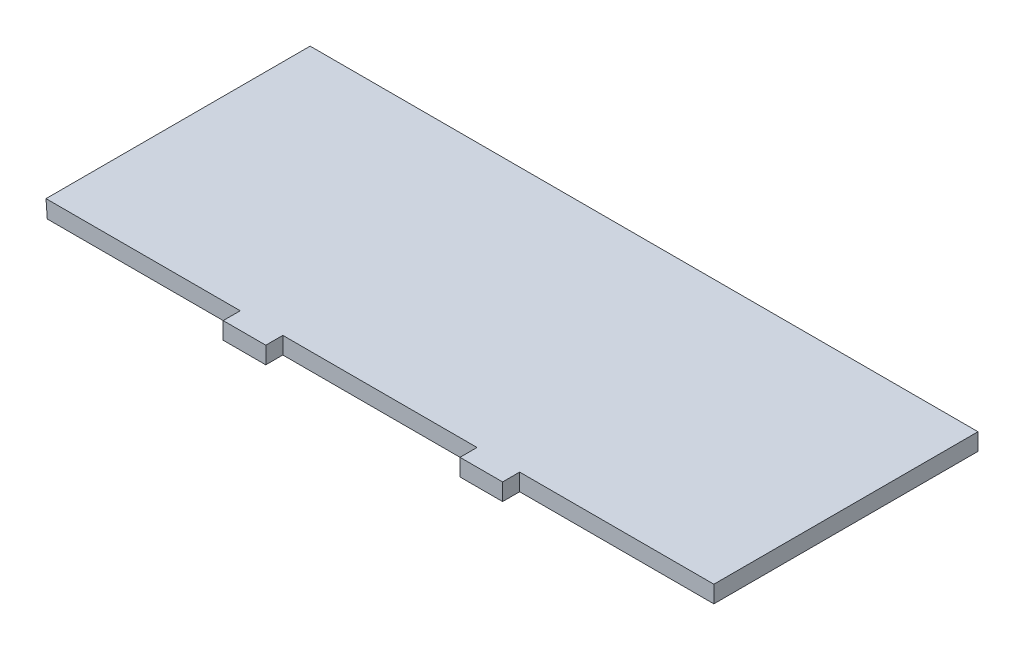
ISO-10303-21;
HEADER;
FILE_DESCRIPTION(('STEP AP214'),'2;1');
FILE_NAME('part.step','',(''),(''),'','','');
FILE_SCHEMA(('AUTOMOTIVE_DESIGN { 1 0 10303 214 1 1 1 1 }'));
ENDSEC;
DATA;
#1=APPLICATION_CONTEXT('core data for automotive mechanical design processes');
#2=APPLICATION_PROTOCOL_DEFINITION('international standard','automotive_design',2000,#1);
#3=PRODUCT_CONTEXT('',#1,'mechanical');
#4=PRODUCT('Part','Part','',(#3));
#5=PRODUCT_RELATED_PRODUCT_CATEGORY('part','',(#4));
#6=PRODUCT_DEFINITION_FORMATION('','',#4);
#7=PRODUCT_DEFINITION_CONTEXT('part definition',#1,'design');
#8=PRODUCT_DEFINITION('design','',#6,#7);
#9=PRODUCT_DEFINITION_SHAPE('','',#8);
#10=(LENGTH_UNIT() NAMED_UNIT(*) SI_UNIT(.MILLI.,.METRE.));
#11=(NAMED_UNIT(*) PLANE_ANGLE_UNIT() SI_UNIT($,.RADIAN.));
#12=(NAMED_UNIT(*) SI_UNIT($,.STERADIAN.) SOLID_ANGLE_UNIT());
#13=UNCERTAINTY_MEASURE_WITH_UNIT(LENGTH_MEASURE(1.E-05),#10,'distance_accuracy_value','');
#14=(GEOMETRIC_REPRESENTATION_CONTEXT(3) GLOBAL_UNCERTAINTY_ASSIGNED_CONTEXT((#13)) GLOBAL_UNIT_ASSIGNED_CONTEXT((#10,
#11,#12)) REPRESENTATION_CONTEXT('',''));
#15=CARTESIAN_POINT('',(0.,0.,0.));
#16=DIRECTION('',(0.,0.,1.));
#17=DIRECTION('',(1.,0.,0.));
#18=AXIS2_PLACEMENT_3D('',#15,#16,#17);
#19=CARTESIAN_POINT('',(380.,-80.,-940.));
#20=DIRECTION('',(0.,0.,-1.));
#21=DIRECTION('',(-1.,0.,0.));
#22=AXIS2_PLACEMENT_3D('',#19,#20,#21);
#23=PLANE('',#22);
#24=DIRECTION('',(1.,0.,0.));
#25=VECTOR('',#24,1.);
#26=CARTESIAN_POINT('',(377.763621659376,-48.,-940.));
#27=LINE('',#26,#25);
#28=CARTESIAN_POINT('',(405.409686513334,-48.,-940.));
#29=VERTEX_POINT('',#28);
#30=CARTESIAN_POINT('',(428.204843256667,-48.,-940.));
#31=VERTEX_POINT('',#30);
#32=EDGE_CURVE('E64',#29,#31,#27,.T.);
#33=ORIENTED_EDGE('',*,*,#32,.F.);
#34=DIRECTION('',(0.,1.,0.));
#35=VECTOR('',#34,1.);
#36=CARTESIAN_POINT('',(405.409686513334,-50.,-940.));
#37=LINE('',#36,#35);
#38=CARTESIAN_POINT('',(405.409686513334,-50.,-940.));
#39=VERTEX_POINT('',#38);
#40=EDGE_CURVE('E136',#39,#29,#37,.T.);
#41=ORIENTED_EDGE('',*,*,#40,.F.);
#42=DIRECTION('',(1.,0.,0.));
#43=VECTOR('',#42,1.);
#44=CARTESIAN_POINT('',(377.763621659376,-50.,-940.));
#45=LINE('',#44,#43);
#46=CARTESIAN_POINT('',(428.204843256667,-50.,-940.));
#47=VERTEX_POINT('',#46);
#48=EDGE_CURVE('E147',#39,#47,#45,.T.);
#49=ORIENTED_EDGE('',*,*,#48,.T.);
#50=DIRECTION('',(0.,1.,0.));
#51=VECTOR('',#50,1.);
#52=CARTESIAN_POINT('',(428.204843256667,-50.,-940.));
#53=LINE('',#52,#51);
#54=EDGE_CURVE('E180',#47,#31,#53,.T.);
#55=ORIENTED_EDGE('',*,*,#54,.T.);
#56=EDGE_LOOP('',(#33,#41,#49,#55));
#57=FACE_BOUND('',#56,.T.);
#58=ADVANCED_FACE('F42',(#57),#23,.F.);
#59=DIRECTION('',(0.,1.,0.));
#60=VECTOR('',#59,1.);
#61=CARTESIAN_POINT('',(433.204843256667,-50.,-940.));
#62=LINE('',#61,#60);
#63=CARTESIAN_POINT('',(433.204843256667,-50.,-940.));
#64=VERTEX_POINT('',#63);
#65=CARTESIAN_POINT('',(433.204843256667,-48.,-940.));
#66=VERTEX_POINT('',#65);
#67=EDGE_CURVE('E187',#64,#66,#62,.T.);
#68=ORIENTED_EDGE('',*,*,#67,.F.);
#69=CARTESIAN_POINT('',(456.,-50.,-940.));
#70=VERTEX_POINT('',#69);
#71=EDGE_CURVE('E159',#64,#70,#45,.T.);
#72=ORIENTED_EDGE('',*,*,#71,.T.);
#73=DIRECTION('',(0.,-1.,0.));
#74=VECTOR('',#73,1.);
#75=CARTESIAN_POINT('',(456.,150.,-940.));
#76=LINE('',#75,#74);
#77=CARTESIAN_POINT('',(456.,-48.,-940.));
#78=VERTEX_POINT('',#77);
#79=EDGE_CURVE('E195',#78,#70,#76,.T.);
#80=ORIENTED_EDGE('',*,*,#79,.F.);
#81=EDGE_CURVE('E194',#66,#78,#27,.T.);
#82=ORIENTED_EDGE('',*,*,#81,.F.);
#83=EDGE_LOOP('',(#68,#72,#80,#82));
#84=FACE_BOUND('',#83,.T.);
#85=ADVANCED_FACE('F248',(#84),#23,.F.);
#86=CARTESIAN_POINT('',(377.614529770002,-48.,-937.989999999988));
#87=DIRECTION('',(0.997232978197756,0.0743396744332018,0.));
#88=DIRECTION('',(-0.0743396744332018,0.997232978197756,0.));
#89=AXIS2_PLACEMENT_3D('',#86,#87,#88);
#90=PLANE('',#89);
#91=DIRECTION('',(0.,0.,1.));
#92=VECTOR('',#91,1.);
#93=CARTESIAN_POINT('',(377.614529770002,-48.,-971.));
#94=LINE('',#93,#92);
#95=CARTESIAN_POINT('',(377.614529770002,-48.,-971.));
#96=VERTEX_POINT('',#95);
#97=CARTESIAN_POINT('',(377.614529770002,-48.,-940.));
#98=VERTEX_POINT('',#97);
#99=EDGE_CURVE('E198',#96,#98,#94,.T.);
#100=ORIENTED_EDGE('',*,*,#99,.F.);
#101=DIRECTION('',(0.0743396744332018,-0.997232978197756,0.));
#102=VECTOR('',#101,1.);
#103=CARTESIAN_POINT('',(371.9692548713,27.7287994990571,-971.));
#104=LINE('',#103,#102);
#105=CARTESIAN_POINT('',(377.763621659376,-50.,-971.));
#106=VERTEX_POINT('',#105);
#107=EDGE_CURVE('E162',#96,#106,#104,.T.);
#108=ORIENTED_EDGE('',*,*,#107,.T.);
#109=DIRECTION('',(0.,0.,1.));
#110=VECTOR('',#109,1.);
#111=CARTESIAN_POINT('',(377.763621659376,-50.,-971.));
#112=LINE('',#111,#110);
#113=CARTESIAN_POINT('',(377.763621659376,-50.,-940.));
#114=VERTEX_POINT('',#113);
#115=EDGE_CURVE('E163',#106,#114,#112,.T.);
#116=ORIENTED_EDGE('',*,*,#115,.T.);
#117=DIRECTION('',(0.0743396744332018,-0.997232978197756,0.));
#118=VECTOR('',#117,1.);
#119=CARTESIAN_POINT('',(380.,-80.,-940.));
#120=LINE('',#119,#118);
#121=EDGE_CURVE('E46',#98,#114,#120,.T.);
#122=ORIENTED_EDGE('',*,*,#121,.F.);
#123=EDGE_LOOP('',(#100,#108,#116,#122));
#124=FACE_BOUND('',#123,.T.);
#125=ADVANCED_FACE('F218',(#124),#90,.F.);
#126=CARTESIAN_POINT('',(400.409686513334,-50.,-940.));
#127=VERTEX_POINT('',#126);
#128=EDGE_CURVE('E158',#114,#127,#45,.T.);
#129=ORIENTED_EDGE('',*,*,#128,.T.);
#130=DIRECTION('',(0.,1.,0.));
#131=VECTOR('',#130,1.);
#132=CARTESIAN_POINT('',(400.409686513334,-50.,-940.));
#133=LINE('',#132,#131);
#134=CARTESIAN_POINT('',(400.409686513334,-48.,-940.));
#135=VERTEX_POINT('',#134);
#136=EDGE_CURVE('E149',#127,#135,#133,.T.);
#137=ORIENTED_EDGE('',*,*,#136,.T.);
#138=EDGE_CURVE('E190',#98,#135,#27,.T.);
#139=ORIENTED_EDGE('',*,*,#138,.F.);
#140=ORIENTED_EDGE('',*,*,#121,.T.);
#141=EDGE_LOOP('',(#129,#137,#139,#140));
#142=FACE_BOUND('',#141,.T.);
#143=ADVANCED_FACE('F223',(#142),#23,.F.);
#144=CARTESIAN_POINT('',(377.763621659376,-50.,-971.));
#145=DIRECTION('',(0.,-1.,0.));
#146=DIRECTION('',(0.,0.,-1.));
#147=AXIS2_PLACEMENT_3D('',#144,#145,#146);
#148=PLANE('',#147);
#149=DIRECTION('',(0.,0.,-1.));
#150=VECTOR('',#149,1.);
#151=CARTESIAN_POINT('',(456.,-50.,-971.));
#152=LINE('',#151,#150);
#153=CARTESIAN_POINT('',(456.,-50.,-971.));
#154=VERTEX_POINT('',#153);
#155=EDGE_CURVE('E204',#70,#154,#152,.T.);
#156=ORIENTED_EDGE('',*,*,#155,.F.);
#157=ORIENTED_EDGE('',*,*,#71,.F.);
#158=DIRECTION('',(0.,0.,-1.));
#159=VECTOR('',#158,1.);
#160=CARTESIAN_POINT('',(433.204843256667,-50.,-940.));
#161=LINE('',#160,#159);
#162=CARTESIAN_POINT('',(433.204843256667,-50.,-938.));
#163=VERTEX_POINT('',#162);
#164=EDGE_CURVE('E232',#163,#64,#161,.T.);
#165=ORIENTED_EDGE('',*,*,#164,.F.);
#166=DIRECTION('',(1.,0.,0.));
#167=VECTOR('',#166,1.);
#168=CARTESIAN_POINT('',(433.204843256667,-50.,-938.));
#169=LINE('',#168,#167);
#170=CARTESIAN_POINT('',(428.204843256667,-50.,-938.));
#171=VERTEX_POINT('',#170);
#172=EDGE_CURVE('E189',#171,#163,#169,.T.);
#173=ORIENTED_EDGE('',*,*,#172,.F.);
#174=DIRECTION('',(0.,0.,1.));
#175=VECTOR('',#174,1.);
#176=CARTESIAN_POINT('',(428.204843256667,-50.,-940.));
#177=LINE('',#176,#175);
#178=EDGE_CURVE('E157',#47,#171,#177,.T.);
#179=ORIENTED_EDGE('',*,*,#178,.F.);
#180=ORIENTED_EDGE('',*,*,#48,.F.);
#181=DIRECTION('',(0.,0.,-1.));
#182=VECTOR('',#181,1.);
#183=CARTESIAN_POINT('',(405.409686513334,-50.,-940.));
#184=LINE('',#183,#182);
#185=CARTESIAN_POINT('',(405.409686513334,-50.,-938.));
#186=VERTEX_POINT('',#185);
#187=EDGE_CURVE('E133',#186,#39,#184,.T.);
#188=ORIENTED_EDGE('',*,*,#187,.F.);
#189=DIRECTION('',(1.,0.,0.));
#190=VECTOR('',#189,1.);
#191=CARTESIAN_POINT('',(405.409686513334,-50.,-938.));
#192=LINE('',#191,#190);
#193=CARTESIAN_POINT('',(400.409686513334,-50.,-938.));
#194=VERTEX_POINT('',#193);
#195=EDGE_CURVE('E150',#194,#186,#192,.T.);
#196=ORIENTED_EDGE('',*,*,#195,.F.);
#197=DIRECTION('',(0.,0.,1.));
#198=VECTOR('',#197,1.);
#199=CARTESIAN_POINT('',(400.409686513334,-50.,-940.));
#200=LINE('',#199,#198);
#201=EDGE_CURVE('E142',#127,#194,#200,.T.);
#202=ORIENTED_EDGE('',*,*,#201,.F.);
#203=ORIENTED_EDGE('',*,*,#128,.F.);
#204=ORIENTED_EDGE('',*,*,#115,.F.);
#205=DIRECTION('',(1.,0.,0.));
#206=VECTOR('',#205,1.);
#207=CARTESIAN_POINT('',(377.763621659376,-50.,-971.));
#208=LINE('',#207,#206);
#209=EDGE_CURVE('E51',#106,#154,#208,.T.);
#210=ORIENTED_EDGE('',*,*,#209,.T.);
#211=EDGE_LOOP('',(#156,#157,#165,#173,#179,#180,#188,#196,#202,#203,#204,#210));
#212=FACE_BOUND('',#211,.T.);
#213=ADVANCED_FACE('F154',(#212),#148,.T.);
#214=CARTESIAN_POINT('',(0.,0.,-971.));
#215=DIRECTION('',(0.,0.,-1.));
#216=DIRECTION('',(-1.,0.,0.));
#217=AXIS2_PLACEMENT_3D('',#214,#215,#216);
#218=PLANE('',#217);
#219=ORIENTED_EDGE('',*,*,#107,.F.);
#220=DIRECTION('',(1.,0.,0.));
#221=VECTOR('',#220,1.);
#222=CARTESIAN_POINT('',(377.763621659376,-48.,-971.));
#223=LINE('',#222,#221);
#224=CARTESIAN_POINT('',(456.,-48.,-971.));
#225=VERTEX_POINT('',#224);
#226=EDGE_CURVE('E11',#96,#225,#223,.T.);
#227=ORIENTED_EDGE('',*,*,#226,.T.);
#228=DIRECTION('',(0.,1.,0.));
#229=VECTOR('',#228,1.);
#230=CARTESIAN_POINT('',(456.,0.,-971.));
#231=LINE('',#230,#229);
#232=EDGE_CURVE('E200',#154,#225,#231,.T.);
#233=ORIENTED_EDGE('',*,*,#232,.F.);
#234=ORIENTED_EDGE('',*,*,#209,.F.);
#235=EDGE_LOOP('',(#219,#227,#233,#234));
#236=FACE_BOUND('',#235,.T.);
#237=ADVANCED_FACE('F44',(#236),#218,.T.);
#238=CARTESIAN_POINT('',(456.,150.,-938.));
#239=DIRECTION('',(-1.,0.,0.));
#240=DIRECTION('',(0.,0.,1.));
#241=AXIS2_PLACEMENT_3D('',#238,#239,#240);
#242=PLANE('',#241);
#243=DIRECTION('',(0.,0.,1.));
#244=VECTOR('',#243,1.);
#245=CARTESIAN_POINT('',(456.,-48.,-971.));
#246=LINE('',#245,#244);
#247=EDGE_CURVE('E193',#225,#78,#246,.T.);
#248=ORIENTED_EDGE('',*,*,#247,.T.);
#249=ORIENTED_EDGE('',*,*,#79,.T.);
#250=ORIENTED_EDGE('',*,*,#155,.T.);
#251=ORIENTED_EDGE('',*,*,#232,.T.);
#252=EDGE_LOOP('',(#248,#249,#250,#251));
#253=FACE_BOUND('',#252,.T.);
#254=ADVANCED_FACE('F209',(#253),#242,.F.);
#255=CARTESIAN_POINT('',(377.763621659376,-48.,-971.));
#256=DIRECTION('',(0.,-1.,0.));
#257=DIRECTION('',(0.,0.,-1.));
#258=AXIS2_PLACEMENT_3D('',#255,#256,#257);
#259=PLANE('',#258);
#260=ORIENTED_EDGE('',*,*,#99,.T.);
#261=ORIENTED_EDGE('',*,*,#138,.T.);
#262=DIRECTION('',(0.,0.,1.));
#263=VECTOR('',#262,1.);
#264=CARTESIAN_POINT('',(400.409686513334,-48.,-940.));
#265=LINE('',#264,#263);
#266=CARTESIAN_POINT('',(400.409686513334,-48.,-938.));
#267=VERTEX_POINT('',#266);
#268=EDGE_CURVE('E220',#135,#267,#265,.T.);
#269=ORIENTED_EDGE('',*,*,#268,.T.);
#270=DIRECTION('',(1.,0.,0.));
#271=VECTOR('',#270,1.);
#272=CARTESIAN_POINT('',(405.409686513334,-48.,-938.));
#273=LINE('',#272,#271);
#274=CARTESIAN_POINT('',(405.409686513334,-48.,-938.));
#275=VERTEX_POINT('',#274);
#276=EDGE_CURVE('E143',#267,#275,#273,.T.);
#277=ORIENTED_EDGE('',*,*,#276,.T.);
#278=DIRECTION('',(0.,0.,-1.));
#279=VECTOR('',#278,1.);
#280=CARTESIAN_POINT('',(405.409686513334,-48.,-940.));
#281=LINE('',#280,#279);
#282=EDGE_CURVE('E59',#275,#29,#281,.T.);
#283=ORIENTED_EDGE('',*,*,#282,.T.);
#284=ORIENTED_EDGE('',*,*,#32,.T.);
#285=DIRECTION('',(0.,0.,1.));
#286=VECTOR('',#285,1.);
#287=CARTESIAN_POINT('',(428.204843256667,-48.,-940.));
#288=LINE('',#287,#286);
#289=CARTESIAN_POINT('',(428.204843256667,-48.,-938.));
#290=VERTEX_POINT('',#289);
#291=EDGE_CURVE('E237',#31,#290,#288,.T.);
#292=ORIENTED_EDGE('',*,*,#291,.T.);
#293=DIRECTION('',(1.,0.,0.));
#294=VECTOR('',#293,1.);
#295=CARTESIAN_POINT('',(433.204843256667,-48.,-938.));
#296=LINE('',#295,#294);
#297=CARTESIAN_POINT('',(433.204843256667,-48.,-938.));
#298=VERTEX_POINT('',#297);
#299=EDGE_CURVE('E183',#290,#298,#296,.T.);
#300=ORIENTED_EDGE('',*,*,#299,.T.);
#301=DIRECTION('',(0.,0.,-1.));
#302=VECTOR('',#301,1.);
#303=CARTESIAN_POINT('',(433.204843256667,-48.,-940.));
#304=LINE('',#303,#302);
#305=EDGE_CURVE('E236',#298,#66,#304,.T.);
#306=ORIENTED_EDGE('',*,*,#305,.T.);
#307=ORIENTED_EDGE('',*,*,#81,.T.);
#308=ORIENTED_EDGE('',*,*,#247,.F.);
#309=ORIENTED_EDGE('',*,*,#226,.F.);
#310=EDGE_LOOP('',(#260,#261,#269,#277,#283,#284,#292,#300,#306,#307,#308,#309));
#311=FACE_BOUND('',#310,.T.);
#312=ADVANCED_FACE('F212',(#311),#259,.F.);
#313=CARTESIAN_POINT('',(433.204843256667,-50.,-940.));
#314=DIRECTION('',(1.,0.,0.));
#315=DIRECTION('',(0.,0.,-1.));
#316=AXIS2_PLACEMENT_3D('',#313,#314,#315);
#317=PLANE('',#316);
#318=ORIENTED_EDGE('',*,*,#305,.F.);
#319=DIRECTION('',(0.,1.,0.));
#320=VECTOR('',#319,1.);
#321=CARTESIAN_POINT('',(433.204843256667,-50.,-938.));
#322=LINE('',#321,#320);
#323=EDGE_CURVE('E171',#163,#298,#322,.T.);
#324=ORIENTED_EDGE('',*,*,#323,.F.);
#325=ORIENTED_EDGE('',*,*,#164,.T.);
#326=ORIENTED_EDGE('',*,*,#67,.T.);
#327=EDGE_LOOP('',(#318,#324,#325,#326));
#328=FACE_BOUND('',#327,.T.);
#329=ADVANCED_FACE('F246',(#328),#317,.T.);
#330=CARTESIAN_POINT('',(433.204843256667,-50.,-938.));
#331=DIRECTION('',(0.,0.,1.));
#332=DIRECTION('',(1.,0.,0.));
#333=AXIS2_PLACEMENT_3D('',#330,#331,#332);
#334=PLANE('',#333);
#335=ORIENTED_EDGE('',*,*,#299,.F.);
#336=DIRECTION('',(0.,1.,0.));
#337=VECTOR('',#336,1.);
#338=CARTESIAN_POINT('',(428.204843256667,-50.,-938.));
#339=LINE('',#338,#337);
#340=EDGE_CURVE('E174',#171,#290,#339,.T.);
#341=ORIENTED_EDGE('',*,*,#340,.F.);
#342=ORIENTED_EDGE('',*,*,#172,.T.);
#343=ORIENTED_EDGE('',*,*,#323,.T.);
#344=EDGE_LOOP('',(#335,#341,#342,#343));
#345=FACE_BOUND('',#344,.T.);
#346=ADVANCED_FACE('F239',(#345),#334,.T.);
#347=CARTESIAN_POINT('',(428.204843256667,-50.,-940.));
#348=DIRECTION('',(-1.,0.,0.));
#349=DIRECTION('',(0.,0.,1.));
#350=AXIS2_PLACEMENT_3D('',#347,#348,#349);
#351=PLANE('',#350);
#352=ORIENTED_EDGE('',*,*,#291,.F.);
#353=ORIENTED_EDGE('',*,*,#54,.F.);
#354=ORIENTED_EDGE('',*,*,#178,.T.);
#355=ORIENTED_EDGE('',*,*,#340,.T.);
#356=EDGE_LOOP('',(#352,#353,#354,#355));
#357=FACE_BOUND('',#356,.T.);
#358=ADVANCED_FACE('F241',(#357),#351,.T.);
#359=CARTESIAN_POINT('',(405.409686513334,-50.,-940.));
#360=DIRECTION('',(1.,0.,0.));
#361=DIRECTION('',(0.,0.,-1.));
#362=AXIS2_PLACEMENT_3D('',#359,#360,#361);
#363=PLANE('',#362);
#364=ORIENTED_EDGE('',*,*,#282,.F.);
#365=DIRECTION('',(0.,1.,0.));
#366=VECTOR('',#365,1.);
#367=CARTESIAN_POINT('',(405.409686513334,-50.,-938.));
#368=LINE('',#367,#366);
#369=EDGE_CURVE('E137',#186,#275,#368,.T.);
#370=ORIENTED_EDGE('',*,*,#369,.F.);
#371=ORIENTED_EDGE('',*,*,#187,.T.);
#372=ORIENTED_EDGE('',*,*,#40,.T.);
#373=EDGE_LOOP('',(#364,#370,#371,#372));
#374=FACE_BOUND('',#373,.T.);
#375=ADVANCED_FACE('F135',(#374),#363,.T.);
#376=CARTESIAN_POINT('',(405.409686513334,-50.,-938.));
#377=DIRECTION('',(0.,0.,1.));
#378=DIRECTION('',(1.,0.,0.));
#379=AXIS2_PLACEMENT_3D('',#376,#377,#378);
#380=PLANE('',#379);
#381=ORIENTED_EDGE('',*,*,#276,.F.);
#382=DIRECTION('',(0.,1.,0.));
#383=VECTOR('',#382,1.);
#384=CARTESIAN_POINT('',(400.409686513334,-50.,-938.));
#385=LINE('',#384,#383);
#386=EDGE_CURVE('E227',#194,#267,#385,.T.);
#387=ORIENTED_EDGE('',*,*,#386,.F.);
#388=ORIENTED_EDGE('',*,*,#195,.T.);
#389=ORIENTED_EDGE('',*,*,#369,.T.);
#390=EDGE_LOOP('',(#381,#387,#388,#389));
#391=FACE_BOUND('',#390,.T.);
#392=ADVANCED_FACE('F282',(#391),#380,.T.);
#393=CARTESIAN_POINT('',(400.409686513334,-50.,-940.));
#394=DIRECTION('',(-1.,0.,0.));
#395=DIRECTION('',(0.,0.,1.));
#396=AXIS2_PLACEMENT_3D('',#393,#394,#395);
#397=PLANE('',#396);
#398=ORIENTED_EDGE('',*,*,#268,.F.);
#399=ORIENTED_EDGE('',*,*,#136,.F.);
#400=ORIENTED_EDGE('',*,*,#201,.T.);
#401=ORIENTED_EDGE('',*,*,#386,.T.);
#402=EDGE_LOOP('',(#398,#399,#400,#401));
#403=FACE_BOUND('',#402,.T.);
#404=ADVANCED_FACE('F283',(#403),#397,.T.);
#405=CLOSED_SHELL('',(#58,#85,#125,#143,#213,#237,#254,#312,#329,#346,#358,#375,#392,#404));
#406=MANIFOLD_SOLID_BREP('B2',#405);
#407=ADVANCED_BREP_SHAPE_REPRESENTATION('',(#18,#406),#14);
#408=SHAPE_DEFINITION_REPRESENTATION(#9,#407);
ENDSEC;
END-ISO-10303-21;
